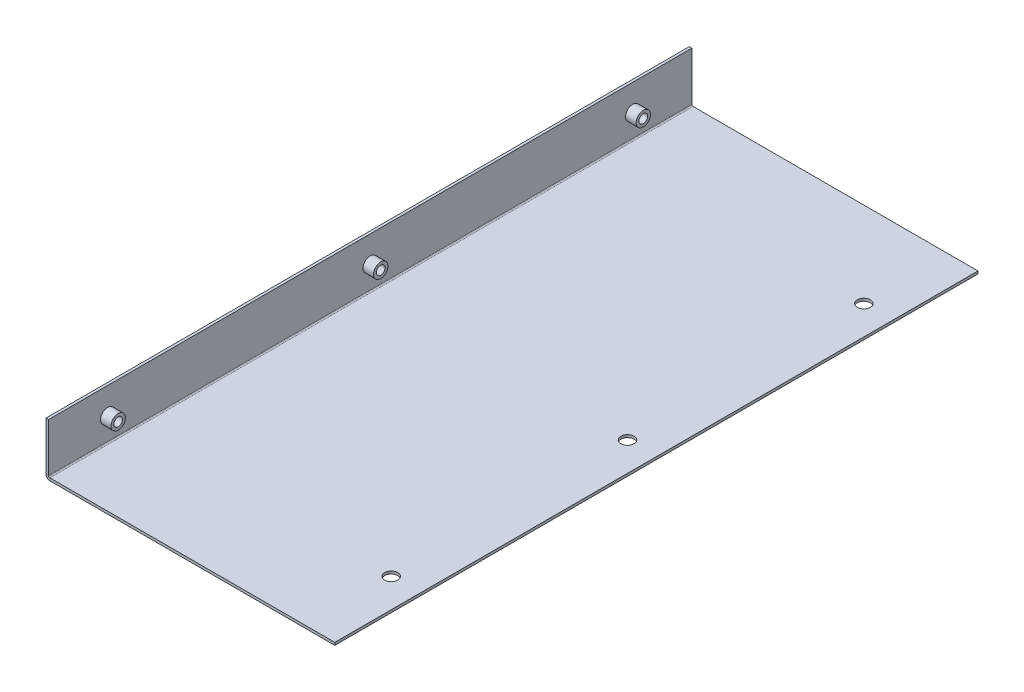
ISO-10303-21;
HEADER;
FILE_DESCRIPTION(('STEP AP214'),'2;1');
FILE_NAME('part.step','',(''),(''),'','','');
FILE_SCHEMA(('AUTOMOTIVE_DESIGN { 1 0 10303 214 1 1 1 1 }'));
ENDSEC;
DATA;
#1=APPLICATION_CONTEXT('core data for automotive mechanical design processes');
#2=APPLICATION_PROTOCOL_DEFINITION('international standard','automotive_design',2000,#1);
#3=PRODUCT_CONTEXT('',#1,'mechanical');
#4=PRODUCT('Part','Part','',(#3));
#5=PRODUCT_RELATED_PRODUCT_CATEGORY('part','',(#4));
#6=PRODUCT_DEFINITION_FORMATION('','',#4);
#7=PRODUCT_DEFINITION_CONTEXT('part definition',#1,'design');
#8=PRODUCT_DEFINITION('design','',#6,#7);
#9=PRODUCT_DEFINITION_SHAPE('','',#8);
#10=(LENGTH_UNIT() NAMED_UNIT(*) SI_UNIT(.MILLI.,.METRE.));
#11=(NAMED_UNIT(*) PLANE_ANGLE_UNIT() SI_UNIT($,.RADIAN.));
#12=(NAMED_UNIT(*) SI_UNIT($,.STERADIAN.) SOLID_ANGLE_UNIT());
#13=UNCERTAINTY_MEASURE_WITH_UNIT(LENGTH_MEASURE(1.E-05),#10,'distance_accuracy_value','');
#14=(GEOMETRIC_REPRESENTATION_CONTEXT(3) GLOBAL_UNCERTAINTY_ASSIGNED_CONTEXT((#13)) GLOBAL_UNIT_ASSIGNED_CONTEXT((#10,
#11,#12)) REPRESENTATION_CONTEXT('',''));
#15=CARTESIAN_POINT('',(0.,0.,0.));
#16=DIRECTION('',(0.,0.,1.));
#17=DIRECTION('',(1.,0.,0.));
#18=AXIS2_PLACEMENT_3D('',#15,#16,#17);
#19=CARTESIAN_POINT('',(0.,1.5,122.5));
#20=DIRECTION('',(0.,0.,1.));
#21=DIRECTION('',(1.,0.,0.));
#22=AXIS2_PLACEMENT_3D('',#19,#20,#21);
#23=PLANE('',#22);
#24=DIRECTION('',(1.,0.,0.));
#25=VECTOR('',#24,1.);
#26=CARTESIAN_POINT('',(0.,1.5,122.5));
#27=LINE('',#26,#25);
#28=CARTESIAN_POINT('',(0.,1.5,122.5));
#29=VERTEX_POINT('',#28);
#30=CARTESIAN_POINT('',(1.,1.5,122.5));
#31=VERTEX_POINT('',#30);
#32=EDGE_CURVE('E178',#29,#31,#27,.T.);
#33=ORIENTED_EDGE('',*,*,#32,.F.);
#34=CARTESIAN_POINT('',(1.5,1.5,122.5));
#35=DIRECTION('',(0.,0.,-1.));
#36=DIRECTION('',(-1.,0.,0.));
#37=AXIS2_PLACEMENT_3D('',#34,#35,#36);
#38=CIRCLE('',#37,1.5);
#39=CARTESIAN_POINT('',(1.5,0.,122.5));
#40=VERTEX_POINT('',#39);
#41=EDGE_CURVE('E130',#29,#40,#38,.F.);
#42=ORIENTED_EDGE('',*,*,#41,.T.);
#43=DIRECTION('',(0.,-1.,0.));
#44=VECTOR('',#43,1.);
#45=CARTESIAN_POINT('',(1.5,1.,122.5));
#46=LINE('',#45,#44);
#47=CARTESIAN_POINT('',(1.5,1.,122.5));
#48=VERTEX_POINT('',#47);
#49=EDGE_CURVE('E54',#48,#40,#46,.T.);
#50=ORIENTED_EDGE('',*,*,#49,.F.);
#51=CARTESIAN_POINT('',(1.5,1.5,122.5));
#52=DIRECTION('',(0.,0.,1.));
#53=DIRECTION('',(1.,0.,0.));
#54=AXIS2_PLACEMENT_3D('',#51,#52,#53);
#55=CIRCLE('',#54,0.5);
#56=EDGE_CURVE('E137',#31,#48,#55,.T.);
#57=ORIENTED_EDGE('',*,*,#56,.F.);
#58=EDGE_LOOP('',(#33,#42,#50,#57));
#59=FACE_BOUND('',#58,.T.);
#60=ADVANCED_FACE('F36',(#59),#23,.T.);
#61=CARTESIAN_POINT('',(1.5,1.,122.5));
#62=DIRECTION('',(0.,0.,1.));
#63=DIRECTION('',(1.,0.,0.));
#64=AXIS2_PLACEMENT_3D('',#61,#62,#63);
#65=PLANE('',#64);
#66=DIRECTION('',(0.,-1.,0.));
#67=VECTOR('',#66,1.);
#68=CARTESIAN_POINT('',(0.,20.,122.5));
#69=LINE('',#68,#67);
#70=CARTESIAN_POINT('',(0.,20.,122.5));
#71=VERTEX_POINT('',#70);
#72=EDGE_CURVE('E125',#71,#29,#69,.T.);
#73=ORIENTED_EDGE('',*,*,#72,.T.);
#74=ORIENTED_EDGE('',*,*,#32,.T.);
#75=DIRECTION('',(0.,-1.,0.));
#76=VECTOR('',#75,1.);
#77=CARTESIAN_POINT('',(0.999999999999999,20.,122.5));
#78=LINE('',#77,#76);
#79=CARTESIAN_POINT('',(0.999999999999999,20.,122.5));
#80=VERTEX_POINT('',#79);
#81=EDGE_CURVE('E135',#80,#31,#78,.T.);
#82=ORIENTED_EDGE('',*,*,#81,.F.);
#83=DIRECTION('',(1.,0.,0.));
#84=VECTOR('',#83,1.);
#85=CARTESIAN_POINT('',(0.,20.,122.5));
#86=LINE('',#85,#84);
#87=EDGE_CURVE('E116',#71,#80,#86,.T.);
#88=ORIENTED_EDGE('',*,*,#87,.F.);
#89=EDGE_LOOP('',(#73,#74,#82,#88));
#90=FACE_BOUND('',#89,.T.);
#91=ADVANCED_FACE('F133',(#90),#65,.T.);
#92=CARTESIAN_POINT('',(1.5,0.,-122.5));
#93=DIRECTION('',(0.,0.,-1.));
#94=DIRECTION('',(-1.,0.,0.));
#95=AXIS2_PLACEMENT_3D('',#92,#93,#94);
#96=PLANE('',#95);
#97=DIRECTION('',(0.,1.,0.));
#98=VECTOR('',#97,1.);
#99=CARTESIAN_POINT('',(1.5,0.,-122.5));
#100=LINE('',#99,#98);
#101=CARTESIAN_POINT('',(1.5,0.,-122.5));
#102=VERTEX_POINT('',#101);
#103=CARTESIAN_POINT('',(1.5,1.,-122.5));
#104=VERTEX_POINT('',#103);
#105=EDGE_CURVE('E90',#102,#104,#100,.T.);
#106=ORIENTED_EDGE('',*,*,#105,.F.);
#107=CARTESIAN_POINT('',(1.5,1.5,-122.5));
#108=DIRECTION('',(0.,0.,-1.));
#109=DIRECTION('',(-1.,0.,0.));
#110=AXIS2_PLACEMENT_3D('',#107,#108,#109);
#111=CIRCLE('',#110,1.5);
#112=CARTESIAN_POINT('',(0.,1.5,-122.5));
#113=VERTEX_POINT('',#112);
#114=EDGE_CURVE('E160',#113,#102,#111,.F.);
#115=ORIENTED_EDGE('',*,*,#114,.F.);
#116=DIRECTION('',(-1.,0.,0.));
#117=VECTOR('',#116,1.);
#118=CARTESIAN_POINT('',(1.,1.5,-122.5));
#119=LINE('',#118,#117);
#120=CARTESIAN_POINT('',(1.,1.5,-122.5));
#121=VERTEX_POINT('',#120);
#122=EDGE_CURVE('E83',#121,#113,#119,.T.);
#123=ORIENTED_EDGE('',*,*,#122,.F.);
#124=CARTESIAN_POINT('',(1.5,1.5,-122.5));
#125=DIRECTION('',(0.,0.,1.));
#126=DIRECTION('',(1.,0.,0.));
#127=AXIS2_PLACEMENT_3D('',#124,#125,#126);
#128=CIRCLE('',#127,0.5);
#129=EDGE_CURVE('E153',#121,#104,#128,.T.);
#130=ORIENTED_EDGE('',*,*,#129,.T.);
#131=EDGE_LOOP('',(#106,#115,#123,#130));
#132=FACE_BOUND('',#131,.T.);
#133=ADVANCED_FACE('F228',(#132),#96,.T.);
#134=CARTESIAN_POINT('',(1.,1.5,-122.5));
#135=DIRECTION('',(0.,0.,-1.));
#136=DIRECTION('',(-1.,0.,0.));
#137=AXIS2_PLACEMENT_3D('',#134,#135,#136);
#138=PLANE('',#137);
#139=DIRECTION('',(1.,0.,0.));
#140=VECTOR('',#139,1.);
#141=CARTESIAN_POINT('',(0.,0.,-122.5));
#142=LINE('',#141,#140);
#143=CARTESIAN_POINT('',(110.,0.,-122.5));
#144=VERTEX_POINT('',#143);
#145=EDGE_CURVE('E143',#102,#144,#142,.T.);
#146=ORIENTED_EDGE('',*,*,#145,.F.);
#147=ORIENTED_EDGE('',*,*,#105,.T.);
#148=DIRECTION('',(1.,0.,0.));
#149=VECTOR('',#148,1.);
#150=CARTESIAN_POINT('',(0.,1.,-122.5));
#151=LINE('',#150,#149);
#152=CARTESIAN_POINT('',(110.,1.,-122.5));
#153=VERTEX_POINT('',#152);
#154=EDGE_CURVE('E150',#104,#153,#151,.T.);
#155=ORIENTED_EDGE('',*,*,#154,.T.);
#156=DIRECTION('',(0.,-1.,0.));
#157=VECTOR('',#156,1.);
#158=CARTESIAN_POINT('',(110.,1.,-122.5));
#159=LINE('',#158,#157);
#160=EDGE_CURVE('E146',#153,#144,#159,.T.);
#161=ORIENTED_EDGE('',*,*,#160,.T.);
#162=EDGE_LOOP('',(#146,#147,#155,#161));
#163=FACE_BOUND('',#162,.T.);
#164=ADVANCED_FACE('F230',(#163),#138,.T.);
#165=CARTESIAN_POINT('',(0.,0.,122.5));
#166=DIRECTION('',(0.,1.,0.));
#167=DIRECTION('',(0.,0.,1.));
#168=AXIS2_PLACEMENT_3D('',#165,#166,#167);
#169=PLANE('',#168);
#170=CARTESIAN_POINT('',(99.,0.,90.));
#171=DIRECTION('',(0.,1.,0.));
#172=DIRECTION('',(0.,0.,1.));
#173=AXIS2_PLACEMENT_3D('',#170,#171,#172);
#174=CIRCLE('',#173,2.5);
#175=CARTESIAN_POINT('',(99.,0.,92.5));
#176=VERTEX_POINT('',#175);
#177=EDGE_CURVE('E193',#176,#176,#174,.F.);
#178=ORIENTED_EDGE('',*,*,#177,.F.);
#179=EDGE_LOOP('',(#178));
#180=FACE_BOUND('',#179,.T.);
#181=CARTESIAN_POINT('',(99.,0.,-90.));
#182=DIRECTION('',(0.,1.,0.));
#183=DIRECTION('',(0.,0.,1.));
#184=AXIS2_PLACEMENT_3D('',#181,#182,#183);
#185=CIRCLE('',#184,2.5);
#186=CARTESIAN_POINT('',(99.,0.,-87.5));
#187=VERTEX_POINT('',#186);
#188=EDGE_CURVE('E199',#187,#187,#185,.F.);
#189=ORIENTED_EDGE('',*,*,#188,.F.);
#190=EDGE_LOOP('',(#189));
#191=FACE_BOUND('',#190,.T.);
#192=CARTESIAN_POINT('',(99.,0.,0.));
#193=DIRECTION('',(0.,1.,0.));
#194=DIRECTION('',(0.,0.,1.));
#195=AXIS2_PLACEMENT_3D('',#192,#193,#194);
#196=CIRCLE('',#195,2.5);
#197=CARTESIAN_POINT('',(99.,0.,2.5));
#198=VERTEX_POINT('',#197);
#199=EDGE_CURVE('E147',#198,#198,#196,.F.);
#200=ORIENTED_EDGE('',*,*,#199,.F.);
#201=EDGE_LOOP('',(#200));
#202=FACE_BOUND('',#201,.T.);
#203=ORIENTED_EDGE('',*,*,#145,.T.);
#204=DIRECTION('',(0.,0.,-1.));
#205=VECTOR('',#204,1.);
#206=CARTESIAN_POINT('',(110.,0.,122.5));
#207=LINE('',#206,#205);
#208=CARTESIAN_POINT('',(110.,0.,122.5));
#209=VERTEX_POINT('',#208);
#210=EDGE_CURVE('E174',#209,#144,#207,.T.);
#211=ORIENTED_EDGE('',*,*,#210,.F.);
#212=DIRECTION('',(1.,0.,0.));
#213=VECTOR('',#212,1.);
#214=CARTESIAN_POINT('',(0.,0.,122.5));
#215=LINE('',#214,#213);
#216=EDGE_CURVE('E96',#40,#209,#215,.T.);
#217=ORIENTED_EDGE('',*,*,#216,.F.);
#218=DIRECTION('',(0.,0.,-1.));
#219=VECTOR('',#218,1.);
#220=CARTESIAN_POINT('',(1.5,0.,122.5));
#221=LINE('',#220,#219);
#222=EDGE_CURVE('E142',#40,#102,#221,.T.);
#223=ORIENTED_EDGE('',*,*,#222,.T.);
#224=EDGE_LOOP('',(#203,#211,#217,#223));
#225=FACE_BOUND('',#224,.T.);
#226=ADVANCED_FACE('F236',(#180,#191,#202,#225),#169,.F.);
#227=CARTESIAN_POINT('',(110.,1.,122.5));
#228=DIRECTION('',(1.,0.,0.));
#229=DIRECTION('',(0.,0.,-1.));
#230=AXIS2_PLACEMENT_3D('',#227,#228,#229);
#231=PLANE('',#230);
#232=ORIENTED_EDGE('',*,*,#160,.F.);
#233=DIRECTION('',(0.,0.,-1.));
#234=VECTOR('',#233,1.);
#235=CARTESIAN_POINT('',(110.,1.,122.5));
#236=LINE('',#235,#234);
#237=CARTESIAN_POINT('',(110.,1.,122.5));
#238=VERTEX_POINT('',#237);
#239=EDGE_CURVE('E172',#238,#153,#236,.T.);
#240=ORIENTED_EDGE('',*,*,#239,.F.);
#241=DIRECTION('',(0.,-1.,0.));
#242=VECTOR('',#241,1.);
#243=CARTESIAN_POINT('',(110.,1.,122.5));
#244=LINE('',#243,#242);
#245=EDGE_CURVE('E208',#238,#209,#244,.T.);
#246=ORIENTED_EDGE('',*,*,#245,.T.);
#247=ORIENTED_EDGE('',*,*,#210,.T.);
#248=EDGE_LOOP('',(#232,#240,#246,#247));
#249=FACE_BOUND('',#248,.T.);
#250=ADVANCED_FACE('F266',(#249),#231,.T.);
#251=CARTESIAN_POINT('',(0.,1.,122.5));
#252=DIRECTION('',(0.,1.,0.));
#253=DIRECTION('',(0.,0.,1.));
#254=AXIS2_PLACEMENT_3D('',#251,#252,#253);
#255=PLANE('',#254);
#256=CARTESIAN_POINT('',(99.,1.,90.));
#257=DIRECTION('',(0.,1.,0.));
#258=DIRECTION('',(0.,0.,1.));
#259=AXIS2_PLACEMENT_3D('',#256,#257,#258);
#260=CIRCLE('',#259,2.5);
#261=CARTESIAN_POINT('',(99.,1.,92.5));
#262=VERTEX_POINT('',#261);
#263=EDGE_CURVE('E190',#262,#262,#260,.T.);
#264=ORIENTED_EDGE('',*,*,#263,.F.);
#265=EDGE_LOOP('',(#264));
#266=FACE_BOUND('',#265,.T.);
#267=CARTESIAN_POINT('',(99.,1.,-90.));
#268=DIRECTION('',(0.,1.,0.));
#269=DIRECTION('',(0.,0.,1.));
#270=AXIS2_PLACEMENT_3D('',#267,#268,#269);
#271=CIRCLE('',#270,2.5);
#272=CARTESIAN_POINT('',(99.,1.,-87.5));
#273=VERTEX_POINT('',#272);
#274=EDGE_CURVE('E196',#273,#273,#271,.T.);
#275=ORIENTED_EDGE('',*,*,#274,.F.);
#276=EDGE_LOOP('',(#275));
#277=FACE_BOUND('',#276,.T.);
#278=CARTESIAN_POINT('',(99.,1.,0.));
#279=DIRECTION('',(0.,1.,0.));
#280=DIRECTION('',(0.,0.,1.));
#281=AXIS2_PLACEMENT_3D('',#278,#279,#280);
#282=CIRCLE('',#281,2.5);
#283=CARTESIAN_POINT('',(99.,1.,2.5));
#284=VERTEX_POINT('',#283);
#285=EDGE_CURVE('E202',#284,#284,#282,.T.);
#286=ORIENTED_EDGE('',*,*,#285,.F.);
#287=EDGE_LOOP('',(#286));
#288=FACE_BOUND('',#287,.T.);
#289=ORIENTED_EDGE('',*,*,#154,.F.);
#290=DIRECTION('',(0.,0.,-1.));
#291=VECTOR('',#290,1.);
#292=CARTESIAN_POINT('',(1.5,1.,122.5));
#293=LINE('',#292,#291);
#294=EDGE_CURVE('E169',#48,#104,#293,.T.);
#295=ORIENTED_EDGE('',*,*,#294,.F.);
#296=DIRECTION('',(1.,0.,0.));
#297=VECTOR('',#296,1.);
#298=CARTESIAN_POINT('',(0.,1.,122.5));
#299=LINE('',#298,#297);
#300=EDGE_CURVE('E211',#48,#238,#299,.T.);
#301=ORIENTED_EDGE('',*,*,#300,.T.);
#302=ORIENTED_EDGE('',*,*,#239,.T.);
#303=EDGE_LOOP('',(#289,#295,#301,#302));
#304=FACE_BOUND('',#303,.T.);
#305=ADVANCED_FACE('F271',(#266,#277,#288,#304),#255,.T.);
#306=CARTESIAN_POINT('',(1.5,1.5,122.5));
#307=DIRECTION('',(0.,0.,-1.));
#308=DIRECTION('',(-1.,0.,0.));
#309=AXIS2_PLACEMENT_3D('',#306,#307,#308);
#310=CYLINDRICAL_SURFACE('',#309,0.5);
#311=ORIENTED_EDGE('',*,*,#129,.F.);
#312=DIRECTION('',(0.,0.,-1.));
#313=VECTOR('',#312,1.);
#314=CARTESIAN_POINT('',(1.,1.5,122.5));
#315=LINE('',#314,#313);
#316=EDGE_CURVE('E166',#31,#121,#315,.T.);
#317=ORIENTED_EDGE('',*,*,#316,.F.);
#318=ORIENTED_EDGE('',*,*,#56,.T.);
#319=ORIENTED_EDGE('',*,*,#294,.T.);
#320=EDGE_LOOP('',(#311,#317,#318,#319));
#321=FACE_BOUND('',#320,.T.);
#322=ADVANCED_FACE('F217',(#321),#310,.F.);
#323=CARTESIAN_POINT('',(0.999999999999999,20.,122.5));
#324=DIRECTION('',(1.,0.,0.));
#325=DIRECTION('',(0.,1.,0.));
#326=AXIS2_PLACEMENT_3D('',#323,#324,#325);
#327=PLANE('',#326);
#328=CARTESIAN_POINT('',(1.,10.,100.));
#329=DIRECTION('',(1.,0.,0.));
#330=DIRECTION('',(0.,1.,0.));
#331=AXIS2_PLACEMENT_3D('',#328,#329,#330);
#332=CIRCLE('',#331,2.75000000000001);
#333=CARTESIAN_POINT('',(1.,12.75,100.));
#334=VERTEX_POINT('',#333);
#335=EDGE_CURVE('E11',#334,#334,#332,.T.);
#336=ORIENTED_EDGE('',*,*,#335,.F.);
#337=EDGE_LOOP('',(#336));
#338=FACE_BOUND('',#337,.T.);
#339=CARTESIAN_POINT('',(1.,10.,-100.));
#340=DIRECTION('',(1.,0.,0.));
#341=DIRECTION('',(0.,1.,0.));
#342=AXIS2_PLACEMENT_3D('',#339,#340,#341);
#343=CIRCLE('',#342,2.75000000000001);
#344=CARTESIAN_POINT('',(1.,12.75,-100.));
#345=VERTEX_POINT('',#344);
#346=EDGE_CURVE('E45',#345,#345,#343,.T.);
#347=ORIENTED_EDGE('',*,*,#346,.F.);
#348=EDGE_LOOP('',(#347));
#349=FACE_BOUND('',#348,.T.);
#350=CARTESIAN_POINT('',(1.,10.,0.));
#351=DIRECTION('',(1.,0.,0.));
#352=DIRECTION('',(0.,1.,0.));
#353=AXIS2_PLACEMENT_3D('',#350,#351,#352);
#354=CIRCLE('',#353,2.75);
#355=CARTESIAN_POINT('',(1.,12.75,0.));
#356=VERTEX_POINT('',#355);
#357=EDGE_CURVE('E179',#356,#356,#354,.T.);
#358=ORIENTED_EDGE('',*,*,#357,.F.);
#359=EDGE_LOOP('',(#358));
#360=FACE_BOUND('',#359,.T.);
#361=DIRECTION('',(0.,-1.,0.));
#362=VECTOR('',#361,1.);
#363=CARTESIAN_POINT('',(0.999999999999999,20.,-122.5));
#364=LINE('',#363,#362);
#365=CARTESIAN_POINT('',(0.999999999999999,20.,-122.5));
#366=VERTEX_POINT('',#365);
#367=EDGE_CURVE('E155',#366,#121,#364,.T.);
#368=ORIENTED_EDGE('',*,*,#367,.F.);
#369=DIRECTION('',(0.,0.,-1.));
#370=VECTOR('',#369,1.);
#371=CARTESIAN_POINT('',(0.999999999999999,20.,122.5));
#372=LINE('',#371,#370);
#373=EDGE_CURVE('E120',#80,#366,#372,.T.);
#374=ORIENTED_EDGE('',*,*,#373,.F.);
#375=ORIENTED_EDGE('',*,*,#81,.T.);
#376=ORIENTED_EDGE('',*,*,#316,.T.);
#377=EDGE_LOOP('',(#368,#374,#375,#376));
#378=FACE_BOUND('',#377,.T.);
#379=ADVANCED_FACE('F223',(#338,#349,#360,#378),#327,.T.);
#380=CARTESIAN_POINT('',(0.,20.,122.5));
#381=DIRECTION('',(0.,1.,0.));
#382=DIRECTION('',(0.,0.,1.));
#383=AXIS2_PLACEMENT_3D('',#380,#381,#382);
#384=PLANE('',#383);
#385=DIRECTION('',(1.,0.,0.));
#386=VECTOR('',#385,1.);
#387=CARTESIAN_POINT('',(0.,20.,-122.5));
#388=LINE('',#387,#386);
#389=CARTESIAN_POINT('',(0.,20.,-122.5));
#390=VERTEX_POINT('',#389);
#391=EDGE_CURVE('E118',#390,#366,#388,.T.);
#392=ORIENTED_EDGE('',*,*,#391,.F.);
#393=DIRECTION('',(0.,0.,-1.));
#394=VECTOR('',#393,1.);
#395=CARTESIAN_POINT('',(0.,20.,122.5));
#396=LINE('',#395,#394);
#397=EDGE_CURVE('E112',#71,#390,#396,.T.);
#398=ORIENTED_EDGE('',*,*,#397,.F.);
#399=ORIENTED_EDGE('',*,*,#87,.T.);
#400=ORIENTED_EDGE('',*,*,#373,.T.);
#401=EDGE_LOOP('',(#392,#398,#399,#400));
#402=FACE_BOUND('',#401,.T.);
#403=ADVANCED_FACE('F114',(#402),#384,.T.);
#404=CARTESIAN_POINT('',(0.,20.,122.5));
#405=DIRECTION('',(1.,0.,0.));
#406=DIRECTION('',(0.,1.,0.));
#407=AXIS2_PLACEMENT_3D('',#404,#405,#406);
#408=PLANE('',#407);
#409=CARTESIAN_POINT('',(0.,10.,100.));
#410=DIRECTION('',(-1.,0.,0.));
#411=DIRECTION('',(0.,0.,1.));
#412=AXIS2_PLACEMENT_3D('',#409,#410,#411);
#413=CIRCLE('',#412,1.64999999999999);
#414=CARTESIAN_POINT('',(0.,10.,101.65));
#415=VERTEX_POINT('',#414);
#416=EDGE_CURVE('E492',#415,#415,#413,.T.);
#417=ORIENTED_EDGE('',*,*,#416,.F.);
#418=EDGE_LOOP('',(#417));
#419=FACE_BOUND('',#418,.T.);
#420=CARTESIAN_POINT('',(0.,10.,0.));
#421=DIRECTION('',(-1.,0.,0.));
#422=DIRECTION('',(0.,0.,1.));
#423=AXIS2_PLACEMENT_3D('',#420,#421,#422);
#424=CIRCLE('',#423,1.64999999999999);
#425=CARTESIAN_POINT('',(0.,10.,1.64999999999999));
#426=VERTEX_POINT('',#425);
#427=EDGE_CURVE('E496',#426,#426,#424,.T.);
#428=ORIENTED_EDGE('',*,*,#427,.F.);
#429=EDGE_LOOP('',(#428));
#430=FACE_BOUND('',#429,.T.);
#431=CARTESIAN_POINT('',(0.,10.,-100.));
#432=DIRECTION('',(-1.,0.,0.));
#433=DIRECTION('',(0.,0.,1.));
#434=AXIS2_PLACEMENT_3D('',#431,#432,#433);
#435=CIRCLE('',#434,1.64999999999999);
#436=CARTESIAN_POINT('',(0.,10.,-98.35));
#437=VERTEX_POINT('',#436);
#438=EDGE_CURVE('E505',#437,#437,#435,.T.);
#439=ORIENTED_EDGE('',*,*,#438,.F.);
#440=EDGE_LOOP('',(#439));
#441=FACE_BOUND('',#440,.T.);
#442=DIRECTION('',(0.,-1.,0.));
#443=VECTOR('',#442,1.);
#444=CARTESIAN_POINT('',(0.,20.,-122.5));
#445=LINE('',#444,#443);
#446=EDGE_CURVE('E158',#390,#113,#445,.T.);
#447=ORIENTED_EDGE('',*,*,#446,.T.);
#448=DIRECTION('',(0.,0.,-1.));
#449=VECTOR('',#448,1.);
#450=CARTESIAN_POINT('',(0.,1.5,122.5));
#451=LINE('',#450,#449);
#452=EDGE_CURVE('E121',#29,#113,#451,.T.);
#453=ORIENTED_EDGE('',*,*,#452,.F.);
#454=ORIENTED_EDGE('',*,*,#72,.F.);
#455=ORIENTED_EDGE('',*,*,#397,.T.);
#456=EDGE_LOOP('',(#447,#453,#454,#455));
#457=FACE_BOUND('',#456,.T.);
#458=ADVANCED_FACE('F126',(#419,#430,#441,#457),#408,.F.);
#459=CARTESIAN_POINT('',(1.5,1.5,122.5));
#460=DIRECTION('',(0.,0.,-1.));
#461=DIRECTION('',(-1.,0.,0.));
#462=AXIS2_PLACEMENT_3D('',#459,#460,#461);
#463=CYLINDRICAL_SURFACE('',#462,1.5);
#464=ORIENTED_EDGE('',*,*,#114,.T.);
#465=ORIENTED_EDGE('',*,*,#222,.F.);
#466=ORIENTED_EDGE('',*,*,#41,.F.);
#467=ORIENTED_EDGE('',*,*,#452,.T.);
#468=EDGE_LOOP('',(#464,#465,#466,#467));
#469=FACE_BOUND('',#468,.T.);
#470=ADVANCED_FACE('F226',(#469),#463,.T.);
#471=CARTESIAN_POINT('',(1.5,1.5,122.5));
#472=DIRECTION('',(0.,0.,1.));
#473=DIRECTION('',(1.,0.,0.));
#474=AXIS2_PLACEMENT_3D('',#471,#472,#473);
#475=PLANE('',#474);
#476=ORIENTED_EDGE('',*,*,#216,.T.);
#477=ORIENTED_EDGE('',*,*,#245,.F.);
#478=ORIENTED_EDGE('',*,*,#300,.F.);
#479=ORIENTED_EDGE('',*,*,#49,.T.);
#480=EDGE_LOOP('',(#476,#477,#478,#479));
#481=FACE_BOUND('',#480,.T.);
#482=ADVANCED_FACE('F306',(#481),#475,.T.);
#483=CARTESIAN_POINT('',(1.5,1.5,-122.5));
#484=DIRECTION('',(0.,0.,1.));
#485=DIRECTION('',(1.,0.,0.));
#486=AXIS2_PLACEMENT_3D('',#483,#484,#485);
#487=PLANE('',#486);
#488=ORIENTED_EDGE('',*,*,#367,.T.);
#489=ORIENTED_EDGE('',*,*,#122,.T.);
#490=ORIENTED_EDGE('',*,*,#446,.F.);
#491=ORIENTED_EDGE('',*,*,#391,.T.);
#492=EDGE_LOOP('',(#488,#489,#490,#491));
#493=FACE_BOUND('',#492,.T.);
#494=ADVANCED_FACE('F224',(#493),#487,.F.);
#495=CARTESIAN_POINT('',(99.,-0.000999999999999916,0.));
#496=DIRECTION('',(0.,1.,0.));
#497=DIRECTION('',(0.,0.,1.));
#498=AXIS2_PLACEMENT_3D('',#495,#496,#497);
#499=CYLINDRICAL_SURFACE('',#498,2.5);
#500=ORIENTED_EDGE('',*,*,#285,.T.);
#501=EDGE_LOOP('',(#500));
#502=FACE_BOUND('',#501,.T.);
#503=ORIENTED_EDGE('',*,*,#199,.T.);
#504=EDGE_LOOP('',(#503));
#505=FACE_BOUND('',#504,.T.);
#506=ADVANCED_FACE('F325',(#502,#505),#499,.F.);
#507=CARTESIAN_POINT('',(99.,-0.000999999999999916,-90.));
#508=DIRECTION('',(0.,1.,0.));
#509=DIRECTION('',(0.,0.,1.));
#510=AXIS2_PLACEMENT_3D('',#507,#508,#509);
#511=CYLINDRICAL_SURFACE('',#510,2.5);
#512=ORIENTED_EDGE('',*,*,#274,.T.);
#513=EDGE_LOOP('',(#512));
#514=FACE_BOUND('',#513,.T.);
#515=ORIENTED_EDGE('',*,*,#188,.T.);
#516=EDGE_LOOP('',(#515));
#517=FACE_BOUND('',#516,.T.);
#518=ADVANCED_FACE('F351',(#514,#517),#511,.F.);
#519=CARTESIAN_POINT('',(99.,-0.000999999999999916,90.));
#520=DIRECTION('',(0.,1.,0.));
#521=DIRECTION('',(0.,0.,1.));
#522=AXIS2_PLACEMENT_3D('',#519,#520,#521);
#523=CYLINDRICAL_SURFACE('',#522,2.5);
#524=ORIENTED_EDGE('',*,*,#263,.T.);
#525=EDGE_LOOP('',(#524));
#526=FACE_BOUND('',#525,.T.);
#527=ORIENTED_EDGE('',*,*,#177,.T.);
#528=EDGE_LOOP('',(#527));
#529=FACE_BOUND('',#528,.T.);
#530=ADVANCED_FACE('F362',(#526,#529),#523,.F.);
#531=CARTESIAN_POINT('',(5.,10.,0.));
#532=DIRECTION('',(-1.,0.,0.));
#533=DIRECTION('',(0.,-1.,0.));
#534=AXIS2_PLACEMENT_3D('',#531,#532,#533);
#535=CYLINDRICAL_SURFACE('',#534,2.75);
#536=ORIENTED_EDGE('',*,*,#357,.T.);
#537=EDGE_LOOP('',(#536));
#538=FACE_BOUND('',#537,.T.);
#539=CARTESIAN_POINT('',(5.,10.,0.));
#540=DIRECTION('',(-1.,0.,0.));
#541=DIRECTION('',(0.,-1.,0.));
#542=AXIS2_PLACEMENT_3D('',#539,#540,#541);
#543=CIRCLE('',#542,2.75);
#544=CARTESIAN_POINT('',(5.,7.25,0.));
#545=VERTEX_POINT('',#544);
#546=EDGE_CURVE('E189',#545,#545,#543,.T.);
#547=ORIENTED_EDGE('',*,*,#546,.T.);
#548=EDGE_LOOP('',(#547));
#549=FACE_BOUND('',#548,.T.);
#550=ADVANCED_FACE('F373',(#538,#549),#535,.T.);
#551=CARTESIAN_POINT('',(5.,10.,0.));
#552=DIRECTION('',(-1.,0.,0.));
#553=DIRECTION('',(0.,-1.,0.));
#554=AXIS2_PLACEMENT_3D('',#551,#552,#553);
#555=PLANE('',#554);
#556=CARTESIAN_POINT('',(5.,10.,0.));
#557=DIRECTION('',(-1.,0.,0.));
#558=DIRECTION('',(0.,-1.,0.));
#559=AXIS2_PLACEMENT_3D('',#556,#557,#558);
#560=CIRCLE('',#559,1.64999999999999);
#561=CARTESIAN_POINT('',(5.,8.35000000000001,0.));
#562=VERTEX_POINT('',#561);
#563=EDGE_CURVE('E499',#562,#562,#560,.T.);
#564=ORIENTED_EDGE('',*,*,#563,.T.);
#565=EDGE_LOOP('',(#564));
#566=FACE_BOUND('',#565,.T.);
#567=ORIENTED_EDGE('',*,*,#546,.F.);
#568=EDGE_LOOP('',(#567));
#569=FACE_BOUND('',#568,.T.);
#570=ADVANCED_FACE('F392',(#566,#569),#555,.F.);
#571=CARTESIAN_POINT('',(5.,10.,-100.));
#572=DIRECTION('',(-1.,0.,0.));
#573=DIRECTION('',(0.,-1.,0.));
#574=AXIS2_PLACEMENT_3D('',#571,#572,#573);
#575=CYLINDRICAL_SURFACE('',#574,2.75000000000001);
#576=ORIENTED_EDGE('',*,*,#346,.T.);
#577=EDGE_LOOP('',(#576));
#578=FACE_BOUND('',#577,.T.);
#579=CARTESIAN_POINT('',(5.,10.,-100.));
#580=DIRECTION('',(-1.,0.,0.));
#581=DIRECTION('',(0.,-1.,0.));
#582=AXIS2_PLACEMENT_3D('',#579,#580,#581);
#583=CIRCLE('',#582,2.75000000000001);
#584=CARTESIAN_POINT('',(5.,7.24999999999999,-100.));
#585=VERTEX_POINT('',#584);
#586=EDGE_CURVE('E510',#585,#585,#583,.T.);
#587=ORIENTED_EDGE('',*,*,#586,.T.);
#588=EDGE_LOOP('',(#587));
#589=FACE_BOUND('',#588,.T.);
#590=ADVANCED_FACE('F399',(#578,#589),#575,.T.);
#591=CARTESIAN_POINT('',(5.,10.,-100.));
#592=DIRECTION('',(-1.,0.,0.));
#593=DIRECTION('',(0.,-1.,0.));
#594=AXIS2_PLACEMENT_3D('',#591,#592,#593);
#595=PLANE('',#594);
#596=CARTESIAN_POINT('',(5.,10.,-100.));
#597=DIRECTION('',(-1.,0.,0.));
#598=DIRECTION('',(0.,-1.,0.));
#599=AXIS2_PLACEMENT_3D('',#596,#597,#598);
#600=CIRCLE('',#599,1.64999999999999);
#601=CARTESIAN_POINT('',(5.,8.35000000000001,-100.));
#602=VERTEX_POINT('',#601);
#603=EDGE_CURVE('E39',#602,#602,#600,.T.);
#604=ORIENTED_EDGE('',*,*,#603,.T.);
#605=EDGE_LOOP('',(#604));
#606=FACE_BOUND('',#605,.T.);
#607=ORIENTED_EDGE('',*,*,#586,.F.);
#608=EDGE_LOOP('',(#607));
#609=FACE_BOUND('',#608,.T.);
#610=ADVANCED_FACE('F404',(#606,#609),#595,.F.);
#611=CARTESIAN_POINT('',(5.,10.,100.));
#612=DIRECTION('',(-1.,0.,0.));
#613=DIRECTION('',(0.,-1.,0.));
#614=AXIS2_PLACEMENT_3D('',#611,#612,#613);
#615=CYLINDRICAL_SURFACE('',#614,2.75000000000001);
#616=ORIENTED_EDGE('',*,*,#335,.T.);
#617=EDGE_LOOP('',(#616));
#618=FACE_BOUND('',#617,.T.);
#619=CARTESIAN_POINT('',(5.,10.,100.));
#620=DIRECTION('',(-1.,0.,0.));
#621=DIRECTION('',(0.,-1.,0.));
#622=AXIS2_PLACEMENT_3D('',#619,#620,#621);
#623=CIRCLE('',#622,2.75000000000001);
#624=CARTESIAN_POINT('',(5.,7.24999999999999,100.));
#625=VERTEX_POINT('',#624);
#626=EDGE_CURVE('E508',#625,#625,#623,.T.);
#627=ORIENTED_EDGE('',*,*,#626,.T.);
#628=EDGE_LOOP('',(#627));
#629=FACE_BOUND('',#628,.T.);
#630=ADVANCED_FACE('F412',(#618,#629),#615,.T.);
#631=CARTESIAN_POINT('',(5.,10.,100.));
#632=DIRECTION('',(-1.,0.,0.));
#633=DIRECTION('',(0.,-1.,0.));
#634=AXIS2_PLACEMENT_3D('',#631,#632,#633);
#635=PLANE('',#634);
#636=CARTESIAN_POINT('',(5.,10.,100.));
#637=DIRECTION('',(-1.,0.,0.));
#638=DIRECTION('',(0.,-1.,0.));
#639=AXIS2_PLACEMENT_3D('',#636,#637,#638);
#640=CIRCLE('',#639,1.64999999999999);
#641=CARTESIAN_POINT('',(5.,8.35000000000001,100.));
#642=VERTEX_POINT('',#641);
#643=EDGE_CURVE('E495',#642,#642,#640,.T.);
#644=ORIENTED_EDGE('',*,*,#643,.T.);
#645=EDGE_LOOP('',(#644));
#646=FACE_BOUND('',#645,.T.);
#647=ORIENTED_EDGE('',*,*,#626,.F.);
#648=EDGE_LOOP('',(#647));
#649=FACE_BOUND('',#648,.T.);
#650=ADVANCED_FACE('F417',(#646,#649),#635,.F.);
#651=CARTESIAN_POINT('',(0.,10.,-100.));
#652=DIRECTION('',(-1.,0.,0.));
#653=DIRECTION('',(0.,0.,1.));
#654=AXIS2_PLACEMENT_3D('',#651,#652,#653);
#655=CYLINDRICAL_SURFACE('',#654,1.64999999999999);
#656=ORIENTED_EDGE('',*,*,#438,.T.);
#657=EDGE_LOOP('',(#656));
#658=FACE_BOUND('',#657,.T.);
#659=ORIENTED_EDGE('',*,*,#603,.F.);
#660=EDGE_LOOP('',(#659));
#661=FACE_BOUND('',#660,.T.);
#662=ADVANCED_FACE('F449',(#658,#661),#655,.F.);
#663=CARTESIAN_POINT('',(0.,10.,0.));
#664=DIRECTION('',(-1.,0.,0.));
#665=DIRECTION('',(0.,0.,1.));
#666=AXIS2_PLACEMENT_3D('',#663,#664,#665);
#667=CYLINDRICAL_SURFACE('',#666,1.64999999999999);
#668=ORIENTED_EDGE('',*,*,#427,.T.);
#669=EDGE_LOOP('',(#668));
#670=FACE_BOUND('',#669,.T.);
#671=ORIENTED_EDGE('',*,*,#563,.F.);
#672=EDGE_LOOP('',(#671));
#673=FACE_BOUND('',#672,.T.);
#674=ADVANCED_FACE('F460',(#670,#673),#667,.F.);
#675=CARTESIAN_POINT('',(0.,10.,100.));
#676=DIRECTION('',(-1.,0.,0.));
#677=DIRECTION('',(0.,0.,1.));
#678=AXIS2_PLACEMENT_3D('',#675,#676,#677);
#679=CYLINDRICAL_SURFACE('',#678,1.64999999999999);
#680=ORIENTED_EDGE('',*,*,#416,.T.);
#681=EDGE_LOOP('',(#680));
#682=FACE_BOUND('',#681,.T.);
#683=ORIENTED_EDGE('',*,*,#643,.F.);
#684=EDGE_LOOP('',(#683));
#685=FACE_BOUND('',#684,.T.);
#686=ADVANCED_FACE('F471',(#682,#685),#679,.F.);
#687=CLOSED_SHELL('',(#60,#91,#133,#164,#226,#250,#305,#322,#379,#403,#458,#470,#482,#494,#506,
#518,#530,#550,#570,#590,#610,#630,#650,#662,#674,#686));
#688=MANIFOLD_SOLID_BREP('B2',#687);
#689=ADVANCED_BREP_SHAPE_REPRESENTATION('',(#18,#688),#14);
#690=SHAPE_DEFINITION_REPRESENTATION(#9,#689);
ENDSEC;
END-ISO-10303-21;
